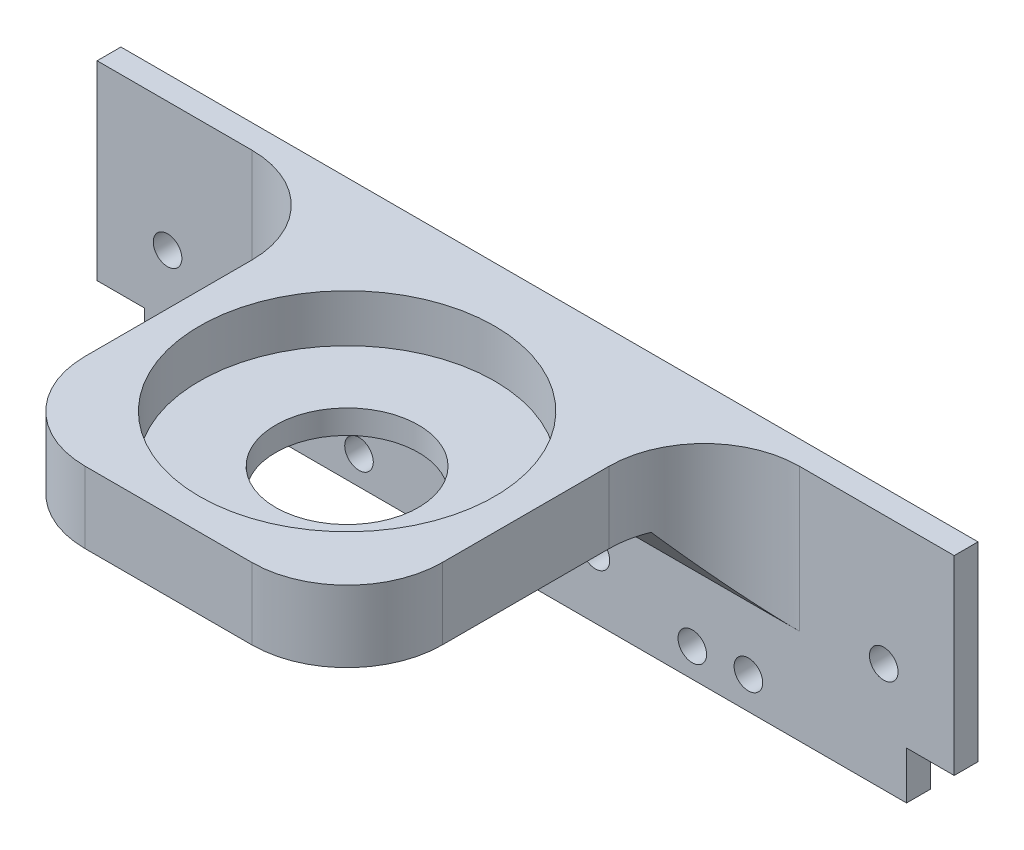
ISO-10303-21;
HEADER;
FILE_DESCRIPTION(('STEP AP214'),'2;1');
FILE_NAME('part.step','',(''),(''),'','','');
FILE_SCHEMA(('AUTOMOTIVE_DESIGN { 1 0 10303 214 1 1 1 1 }'));
ENDSEC;
DATA;
#1=APPLICATION_CONTEXT('core data for automotive mechanical design processes');
#2=APPLICATION_PROTOCOL_DEFINITION('international standard','automotive_design',2000,#1);
#3=PRODUCT_CONTEXT('',#1,'mechanical');
#4=PRODUCT('Part','Part','',(#3));
#5=PRODUCT_RELATED_PRODUCT_CATEGORY('part','',(#4));
#6=PRODUCT_DEFINITION_FORMATION('','',#4);
#7=PRODUCT_DEFINITION_CONTEXT('part definition',#1,'design');
#8=PRODUCT_DEFINITION('design','',#6,#7);
#9=PRODUCT_DEFINITION_SHAPE('','',#8);
#10=(LENGTH_UNIT() NAMED_UNIT(*) SI_UNIT(.MILLI.,.METRE.));
#11=(NAMED_UNIT(*) PLANE_ANGLE_UNIT() SI_UNIT($,.RADIAN.));
#12=(NAMED_UNIT(*) SI_UNIT($,.STERADIAN.) SOLID_ANGLE_UNIT());
#13=UNCERTAINTY_MEASURE_WITH_UNIT(LENGTH_MEASURE(1.E-05),#10,'distance_accuracy_value','');
#14=(GEOMETRIC_REPRESENTATION_CONTEXT(3) GLOBAL_UNCERTAINTY_ASSIGNED_CONTEXT((#13)) GLOBAL_UNIT_ASSIGNED_CONTEXT((#10,
#11,#12)) REPRESENTATION_CONTEXT('',''));
#15=CARTESIAN_POINT('',(0.,0.,0.));
#16=DIRECTION('',(0.,0.,1.));
#17=DIRECTION('',(1.,0.,0.));
#18=AXIS2_PLACEMENT_3D('',#15,#16,#17);
#19=CARTESIAN_POINT('',(5.7960134047091,-7.42640687119285,42.5));
#20=DIRECTION('',(0.,1.,0.));
#21=DIRECTION('',(0.,0.,1.));
#22=AXIS2_PLACEMENT_3D('',#19,#20,#21);
#23=CYLINDRICAL_SURFACE('',#22,15.);
#24=CARTESIAN_POINT('',(5.7960134047091,35.,42.5));
#25=DIRECTION('',(0.,1.,0.));
#26=DIRECTION('',(0.,0.,1.));
#27=AXIS2_PLACEMENT_3D('',#24,#25,#26);
#28=CIRCLE('',#27,15.);
#29=CARTESIAN_POINT('',(5.7960134047091,35.,57.5));
#30=VERTEX_POINT('',#29);
#31=EDGE_CURVE('E210',#30,#30,#28,.F.);
#32=CARTESIAN_POINT('',(5.7960134047091,40.,42.5));
#33=DIRECTION('',(0.,1.,0.));
#34=DIRECTION('',(0.,0.,1.));
#35=AXIS2_PLACEMENT_3D('',#32,#33,#34);
#36=CIRCLE('',#35,15.);
#37=CARTESIAN_POINT('',(5.7960134047091,40.,57.5));
#38=VERTEX_POINT('',#37);
#39=EDGE_CURVE('E207',#38,#38,#36,.F.);
#40=CARTESIAN_POINT('',(5.7960134047091,35.,57.5));
#41=CARTESIAN_POINT('',(5.7960134047091,35.0520833333333,57.5));
#42=CARTESIAN_POINT('',(5.7960134047091,35.1041666666667,57.5));
#43=CARTESIAN_POINT('',(5.7960134047091,35.2083333333333,57.5));
#44=CARTESIAN_POINT('',(5.7960134047091,35.2604166666667,57.5));
#45=CARTESIAN_POINT('',(5.7960134047091,35.3645833333333,57.5));
#46=CARTESIAN_POINT('',(5.7960134047091,35.4166666666667,57.5));
#47=CARTESIAN_POINT('',(5.7960134047091,35.5208333333333,57.5));
#48=CARTESIAN_POINT('',(5.7960134047091,35.5729166666667,57.5));
#49=CARTESIAN_POINT('',(5.7960134047091,35.6770833333333,57.5));
#50=CARTESIAN_POINT('',(5.7960134047091,35.7291666666667,57.5));
#51=CARTESIAN_POINT('',(5.7960134047091,35.8333333333333,57.5));
#52=CARTESIAN_POINT('',(5.7960134047091,35.8854166666667,57.5));
#53=CARTESIAN_POINT('',(5.7960134047091,35.9895833333333,57.5));
#54=CARTESIAN_POINT('',(5.7960134047091,36.0416666666667,57.5));
#55=CARTESIAN_POINT('',(5.7960134047091,36.1458333333333,57.5));
#56=CARTESIAN_POINT('',(5.7960134047091,36.1979166666667,57.5));
#57=CARTESIAN_POINT('',(5.7960134047091,36.3020833333333,57.5));
#58=CARTESIAN_POINT('',(5.7960134047091,36.3541666666667,57.5));
#59=CARTESIAN_POINT('',(5.7960134047091,36.4583333333333,57.5));
#60=CARTESIAN_POINT('',(5.7960134047091,36.5104166666667,57.5));
#61=CARTESIAN_POINT('',(5.7960134047091,36.6145833333333,57.5));
#62=CARTESIAN_POINT('',(5.7960134047091,36.6666666666667,57.5));
#63=CARTESIAN_POINT('',(5.7960134047091,36.7708333333333,57.5));
#64=CARTESIAN_POINT('',(5.7960134047091,36.8229166666667,57.5));
#65=CARTESIAN_POINT('',(5.7960134047091,36.9270833333333,57.5));
#66=CARTESIAN_POINT('',(5.7960134047091,36.9791666666667,57.5));
#67=CARTESIAN_POINT('',(5.7960134047091,37.0833333333333,57.5));
#68=CARTESIAN_POINT('',(5.7960134047091,37.1354166666667,57.5));
#69=CARTESIAN_POINT('',(5.7960134047091,37.2395833333333,57.5));
#70=CARTESIAN_POINT('',(5.7960134047091,37.2916666666667,57.5));
#71=CARTESIAN_POINT('',(5.7960134047091,37.3958333333333,57.5));
#72=CARTESIAN_POINT('',(5.7960134047091,37.4479166666667,57.5));
#73=CARTESIAN_POINT('',(5.7960134047091,37.5520833333333,57.5));
#74=CARTESIAN_POINT('',(5.7960134047091,37.6041666666667,57.5));
#75=CARTESIAN_POINT('',(5.7960134047091,37.7083333333333,57.5));
#76=CARTESIAN_POINT('',(5.7960134047091,37.7604166666667,57.5));
#77=CARTESIAN_POINT('',(5.7960134047091,37.8645833333333,57.5));
#78=CARTESIAN_POINT('',(5.7960134047091,37.9166666666667,57.5));
#79=CARTESIAN_POINT('',(5.7960134047091,38.0208333333333,57.5));
#80=CARTESIAN_POINT('',(5.7960134047091,38.0729166666667,57.5));
#81=CARTESIAN_POINT('',(5.7960134047091,38.1770833333333,57.5));
#82=CARTESIAN_POINT('',(5.7960134047091,38.2291666666667,57.5));
#83=CARTESIAN_POINT('',(5.7960134047091,38.3333333333333,57.5));
#84=CARTESIAN_POINT('',(5.7960134047091,38.3854166666667,57.5));
#85=CARTESIAN_POINT('',(5.7960134047091,38.4895833333333,57.5));
#86=CARTESIAN_POINT('',(5.7960134047091,38.5416666666667,57.5));
#87=CARTESIAN_POINT('',(5.7960134047091,38.6458333333333,57.5));
#88=CARTESIAN_POINT('',(5.7960134047091,38.6979166666667,57.5));
#89=CARTESIAN_POINT('',(5.7960134047091,38.8020833333333,57.5));
#90=CARTESIAN_POINT('',(5.7960134047091,38.8541666666667,57.5));
#91=CARTESIAN_POINT('',(5.7960134047091,38.9583333333333,57.5));
#92=CARTESIAN_POINT('',(5.7960134047091,39.0104166666667,57.5));
#93=CARTESIAN_POINT('',(5.7960134047091,39.1145833333333,57.5));
#94=CARTESIAN_POINT('',(5.7960134047091,39.1666666666667,57.5));
#95=CARTESIAN_POINT('',(5.7960134047091,39.2708333333333,57.5));
#96=CARTESIAN_POINT('',(5.7960134047091,39.3229166666667,57.5));
#97=CARTESIAN_POINT('',(5.7960134047091,39.4270833333333,57.5));
#98=CARTESIAN_POINT('',(5.7960134047091,39.4791666666667,57.5));
#99=CARTESIAN_POINT('',(5.7960134047091,39.5833333333333,57.5));
#100=CARTESIAN_POINT('',(5.7960134047091,39.6354166666667,57.5));
#101=CARTESIAN_POINT('',(5.7960134047091,39.7395833333333,57.5));
#102=CARTESIAN_POINT('',(5.7960134047091,39.7916666666667,57.5));
#103=CARTESIAN_POINT('',(5.7960134047091,39.8958333333333,57.5));
#104=CARTESIAN_POINT('',(5.7960134047091,39.9479166666667,57.5));
#105=CARTESIAN_POINT('',(5.7960134047091,40.,57.5));
#106=B_SPLINE_CURVE_WITH_KNOTS('',3,(#40,#41,#42,#43,#44,#45,#46,#47,#48,#49,#50,#51,#52,#53,
#54,#55,#56,#57,#58,#59,#60,#61,#62,#63,#64,#65,#66,#67,#68,#69,#70,#71,#72,#73,#74,#75,#76,#77,
#78,#79,#80,#81,#82,#83,#84,#85,#86,#87,#88,#89,#90,#91,#92,#93,#94,#95,#96,#97,#98,#99,#100,
#101,#102,#103,#104,#105),.UNSPECIFIED.,.F.,.F.,(4,2,2,2,2,2,2,2,2,2,2,2,2,2,2,2,2,2,2,2,2,2,2,
2,2,2,2,2,2,2,2,2,4),(0.,0.156249999999997,0.3125,0.468750000000004,0.625000000000001,
0.781249999999997,0.937500000000001,1.09375,1.25,1.40625,1.5625,1.71875,1.875,2.03125,2.1875,
2.34375000000001,2.5,2.65625,2.8125,2.96875000000001,3.125,3.28125,3.4375,3.59375000000001,3.75,
3.90625,4.0625,4.21875000000001,4.375,4.53125,4.6875,4.84375000000001,5.),.UNSPECIFIED.);
#107=EDGE_CURVE('BSEAM33',#30,#38,#106,.T.);
#108=ORIENTED_EDGE('',*,*,#31,.T.);
#109=ORIENTED_EDGE('',*,*,#39,.F.);
#110=ORIENTED_EDGE('',*,*,#107,.T.);
#111=ORIENTED_EDGE('',*,*,#107,.F.);
#112=EDGE_LOOP('',(#108,#110,#109,#111));
#113=FACE_BOUND('',#112,.T.);
#114=ADVANCED_FACE('F33',(#113),#23,.F.);
#115=CARTESIAN_POINT('',(0.,0.,5.));
#116=DIRECTION('',(0.,0.,-1.));
#117=DIRECTION('',(-1.,0.,0.));
#118=AXIS2_PLACEMENT_3D('',#115,#116,#117);
#119=PLANE('',#118);
#120=CARTESIAN_POINT('',(20.4535696755675,12.9010851063287,5.));
#121=DIRECTION('',(0.,0.,1.));
#122=DIRECTION('',(-1.,0.,0.));
#123=AXIS2_PLACEMENT_3D('',#120,#121,#122);
#124=CIRCLE('',#123,3.);
#125=CARTESIAN_POINT('',(17.4535696755675,12.9010851063287,5.));
#126=VERTEX_POINT('',#125);
#127=EDGE_CURVE('E288',#126,#126,#124,.T.);
#128=ORIENTED_EDGE('',*,*,#127,.F.);
#129=EDGE_LOOP('',(#128));
#130=FACE_BOUND('',#129,.T.);
#131=CARTESIAN_POINT('',(52.5734958761646,6.77616521020482,5.));
#132=DIRECTION('',(0.,0.,1.));
#133=DIRECTION('',(-1.,0.,0.));
#134=AXIS2_PLACEMENT_3D('',#131,#132,#133);
#135=CIRCLE('',#134,3.00000000000001);
#136=CARTESIAN_POINT('',(49.5734958761646,6.77616521020482,5.));
#137=VERTEX_POINT('',#136);
#138=EDGE_CURVE('E294',#137,#137,#135,.T.);
#139=ORIENTED_EDGE('',*,*,#138,.F.);
#140=EDGE_LOOP('',(#139));
#141=FACE_BOUND('',#140,.T.);
#142=CARTESIAN_POINT('',(80.9980316802519,22.9393971638673,5.));
#143=DIRECTION('',(0.,0.,1.));
#144=DIRECTION('',(-1.,0.,0.));
#145=AXIS2_PLACEMENT_3D('',#142,#143,#144);
#146=CIRCLE('',#145,3.00000000000001);
#147=CARTESIAN_POINT('',(77.9980316802519,22.9393971638673,5.));
#148=VERTEX_POINT('',#147);
#149=EDGE_CURVE('E300',#148,#148,#146,.T.);
#150=ORIENTED_EDGE('',*,*,#149,.F.);
#151=EDGE_LOOP('',(#150));
#152=FACE_BOUND('',#151,.T.);
#153=CARTESIAN_POINT('',(-29.2039865952909,6.00000000000013,5.));
#154=DIRECTION('',(0.,0.,1.));
#155=DIRECTION('',(-1.,0.,0.));
#156=AXIS2_PLACEMENT_3D('',#153,#154,#155);
#157=CIRCLE('',#156,2.99999999999999);
#158=CARTESIAN_POINT('',(-32.2039865952909,6.00000000000013,5.));
#159=VERTEX_POINT('',#158);
#160=EDGE_CURVE('E306',#159,#159,#157,.T.);
#161=ORIENTED_EDGE('',*,*,#160,.F.);
#162=EDGE_LOOP('',(#161));
#163=FACE_BOUND('',#162,.T.);
#164=CARTESIAN_POINT('',(-8.86154286614935,12.9010851063287,5.));
#165=DIRECTION('',(0.,0.,1.));
#166=DIRECTION('',(1.,0.,0.));
#167=AXIS2_PLACEMENT_3D('',#164,#165,#166);
#168=CIRCLE('',#167,3.);
#169=CARTESIAN_POINT('',(-5.86154286614935,12.9010851063287,5.));
#170=VERTEX_POINT('',#169);
#171=EDGE_CURVE('E312',#170,#170,#168,.T.);
#172=ORIENTED_EDGE('',*,*,#171,.F.);
#173=EDGE_LOOP('',(#172));
#174=FACE_BOUND('',#173,.T.);
#175=CARTESIAN_POINT('',(-40.9814690667464,6.77616521020496,5.));
#176=DIRECTION('',(0.,0.,1.));
#177=DIRECTION('',(1.,0.,0.));
#178=AXIS2_PLACEMENT_3D('',#175,#176,#177);
#179=CIRCLE('',#178,3.00000000000001);
#180=CARTESIAN_POINT('',(-37.9814690667464,6.77616521020496,5.));
#181=VERTEX_POINT('',#180);
#182=EDGE_CURVE('E318',#181,#181,#179,.T.);
#183=ORIENTED_EDGE('',*,*,#182,.F.);
#184=EDGE_LOOP('',(#183));
#185=FACE_BOUND('',#184,.T.);
#186=CARTESIAN_POINT('',(-69.4060048708337,22.9393971638675,5.));
#187=DIRECTION('',(0.,0.,1.));
#188=DIRECTION('',(1.,0.,0.));
#189=AXIS2_PLACEMENT_3D('',#186,#187,#188);
#190=CIRCLE('',#189,3.00000000000001);
#191=CARTESIAN_POINT('',(-66.4060048708336,22.9393971638675,5.));
#192=VERTEX_POINT('',#191);
#193=EDGE_CURVE('E324',#192,#192,#190,.T.);
#194=ORIENTED_EDGE('',*,*,#193,.F.);
#195=EDGE_LOOP('',(#194));
#196=FACE_BOUND('',#195,.T.);
#197=CARTESIAN_POINT('',(40.7960134047091,6.,5.));
#198=DIRECTION('',(0.,0.,1.));
#199=DIRECTION('',(1.,0.,0.));
#200=AXIS2_PLACEMENT_3D('',#197,#198,#199);
#201=CIRCLE('',#200,3.);
#202=CARTESIAN_POINT('',(43.7960134047091,6.,5.));
#203=VERTEX_POINT('',#202);
#204=EDGE_CURVE('E196',#203,#203,#201,.T.);
#205=ORIENTED_EDGE('',*,*,#204,.F.);
#206=EDGE_LOOP('',(#205));
#207=FACE_BOUND('',#206,.T.);
#208=DIRECTION('',(0.,-1.,0.));
#209=VECTOR('',#208,1.);
#210=CARTESIAN_POINT('',(85.7960134047091,0.,5.));
#211=LINE('',#210,#209);
#212=CARTESIAN_POINT('',(85.7960134047091,10.,5.));
#213=VERTEX_POINT('',#212);
#214=CARTESIAN_POINT('',(85.7960134047091,0.,5.));
#215=VERTEX_POINT('',#214);
#216=EDGE_CURVE('E152',#213,#215,#211,.T.);
#217=ORIENTED_EDGE('',*,*,#216,.F.);
#218=DIRECTION('',(-1.,0.,0.));
#219=VECTOR('',#218,1.);
#220=CARTESIAN_POINT('',(95.796013404709,9.99999999999991,5.));
#221=LINE('',#220,#219);
#222=CARTESIAN_POINT('',(95.796013404709,9.99999999999991,5.));
#223=VERTEX_POINT('',#222);
#224=EDGE_CURVE('E163',#223,#213,#221,.T.);
#225=ORIENTED_EDGE('',*,*,#224,.F.);
#226=DIRECTION('',(0.,1.,0.));
#227=VECTOR('',#226,1.);
#228=CARTESIAN_POINT('',(95.7960134047091,0.,5.));
#229=LINE('',#228,#227);
#230=CARTESIAN_POINT('',(95.7960134047091,50.,5.));
#231=VERTEX_POINT('',#230);
#232=EDGE_CURVE('E179',#223,#231,#229,.T.);
#233=ORIENTED_EDGE('',*,*,#232,.T.);
#234=DIRECTION('',(-1.,0.,0.));
#235=VECTOR('',#234,1.);
#236=CARTESIAN_POINT('',(-84.2039865952909,50.,5.));
#237=LINE('',#236,#235);
#238=CARTESIAN_POINT('',(63.2960134047091,50.,5.));
#239=VERTEX_POINT('',#238);
#240=EDGE_CURVE('E189',#231,#239,#237,.T.);
#241=ORIENTED_EDGE('',*,*,#240,.T.);
#242=DIRECTION('',(0.,1.,0.));
#243=VECTOR('',#242,1.);
#244=CARTESIAN_POINT('',(63.2960134047091,20.0000000000001,5.));
#245=LINE('',#244,#243);
#246=CARTESIAN_POINT('',(63.2960134047091,20.0000000000001,5.));
#247=VERTEX_POINT('',#246);
#248=EDGE_CURVE('E236',#239,#247,#245,.F.);
#249=ORIENTED_EDGE('',*,*,#248,.T.);
#250=DIRECTION('',(-1.,0.,0.));
#251=VECTOR('',#250,1.);
#252=CARTESIAN_POINT('',(-31.7039865952909,20.0000000000001,5.));
#253=LINE('',#252,#251);
#254=CARTESIAN_POINT('',(-51.7039865952909,20.0000000000001,5.));
#255=VERTEX_POINT('',#254);
#256=EDGE_CURVE('E231',#247,#255,#253,.T.);
#257=ORIENTED_EDGE('',*,*,#256,.T.);
#258=DIRECTION('',(0.,-1.,0.));
#259=VECTOR('',#258,1.);
#260=CARTESIAN_POINT('',(-51.7039865952909,50.,5.));
#261=LINE('',#260,#259);
#262=CARTESIAN_POINT('',(-51.7039865952909,50.,5.));
#263=VERTEX_POINT('',#262);
#264=EDGE_CURVE('E239',#255,#263,#261,.F.);
#265=ORIENTED_EDGE('',*,*,#264,.T.);
#266=CARTESIAN_POINT('',(-84.2039865952909,50.,5.));
#267=VERTEX_POINT('',#266);
#268=EDGE_CURVE('E182',#263,#267,#237,.T.);
#269=ORIENTED_EDGE('',*,*,#268,.T.);
#270=DIRECTION('',(0.,-1.,0.));
#271=VECTOR('',#270,1.);
#272=CARTESIAN_POINT('',(-84.2039865952909,0.,5.));
#273=LINE('',#272,#271);
#274=CARTESIAN_POINT('',(-84.2039865952909,10.,5.));
#275=VERTEX_POINT('',#274);
#276=EDGE_CURVE('E180',#267,#275,#273,.T.);
#277=ORIENTED_EDGE('',*,*,#276,.T.);
#278=DIRECTION('',(-1.,0.,0.));
#279=VECTOR('',#278,1.);
#280=CARTESIAN_POINT('',(-84.2039865952909,10.,5.));
#281=LINE('',#280,#279);
#282=CARTESIAN_POINT('',(-74.2039865952909,10.,5.));
#283=VERTEX_POINT('',#282);
#284=EDGE_CURVE('E467',#283,#275,#281,.T.);
#285=ORIENTED_EDGE('',*,*,#284,.F.);
#286=DIRECTION('',(0.,1.,0.));
#287=VECTOR('',#286,1.);
#288=CARTESIAN_POINT('',(-74.2039865952909,0.,5.));
#289=LINE('',#288,#287);
#290=CARTESIAN_POINT('',(-74.2039865952909,0.,5.));
#291=VERTEX_POINT('',#290);
#292=EDGE_CURVE('E172',#291,#283,#289,.T.);
#293=ORIENTED_EDGE('',*,*,#292,.F.);
#294=DIRECTION('',(1.,0.,0.));
#295=VECTOR('',#294,1.);
#296=CARTESIAN_POINT('',(-84.2039865952909,0.,5.));
#297=LINE('',#296,#295);
#298=EDGE_CURVE('E169',#291,#215,#297,.T.);
#299=ORIENTED_EDGE('',*,*,#298,.T.);
#300=EDGE_LOOP('',(#217,#225,#233,#241,#249,#257,#265,#269,#277,#285,#293,#299));
#301=FACE_BOUND('',#300,.T.);
#302=ADVANCED_FACE('F176',(#130,#141,#152,#163,#174,#185,#196,#207,#301),#119,.F.);
#303=CARTESIAN_POINT('',(0.,0.,0.));
#304=DIRECTION('',(0.,0.,-1.));
#305=DIRECTION('',(-1.,0.,0.));
#306=AXIS2_PLACEMENT_3D('',#303,#304,#305);
#307=PLANE('',#306);
#308=DIRECTION('',(-1.,0.,0.));
#309=VECTOR('',#308,1.);
#310=CARTESIAN_POINT('',(95.796013404709,9.99999999999991,0.));
#311=LINE('',#310,#309);
#312=CARTESIAN_POINT('',(95.7960134047091,9.99999999999991,0.));
#313=VERTEX_POINT('',#312);
#314=CARTESIAN_POINT('',(85.7960134047091,10.,0.));
#315=VERTEX_POINT('',#314);
#316=EDGE_CURVE('E48',#313,#315,#311,.T.);
#317=ORIENTED_EDGE('',*,*,#316,.T.);
#318=DIRECTION('',(0.,-1.,0.));
#319=VECTOR('',#318,1.);
#320=CARTESIAN_POINT('',(85.7960134047091,0.,0.));
#321=LINE('',#320,#319);
#322=CARTESIAN_POINT('',(85.7960134047091,0.,0.));
#323=VERTEX_POINT('',#322);
#324=EDGE_CURVE('E173',#315,#323,#321,.T.);
#325=ORIENTED_EDGE('',*,*,#324,.T.);
#326=DIRECTION('',(1.,0.,0.));
#327=VECTOR('',#326,1.);
#328=CARTESIAN_POINT('',(-84.2039865952909,0.,0.));
#329=LINE('',#328,#327);
#330=CARTESIAN_POINT('',(-74.2039865952909,0.,0.));
#331=VERTEX_POINT('',#330);
#332=EDGE_CURVE('E171',#331,#323,#329,.T.);
#333=ORIENTED_EDGE('',*,*,#332,.F.);
#334=DIRECTION('',(0.,1.,0.));
#335=VECTOR('',#334,1.);
#336=CARTESIAN_POINT('',(-74.2039865952909,0.,0.));
#337=LINE('',#336,#335);
#338=CARTESIAN_POINT('',(-74.2039865952909,10.,0.));
#339=VERTEX_POINT('',#338);
#340=EDGE_CURVE('E56',#331,#339,#337,.T.);
#341=ORIENTED_EDGE('',*,*,#340,.T.);
#342=DIRECTION('',(-1.,0.,0.));
#343=VECTOR('',#342,1.);
#344=CARTESIAN_POINT('',(-84.2039865952909,10.,0.));
#345=LINE('',#344,#343);
#346=CARTESIAN_POINT('',(-84.2039865952909,10.,0.));
#347=VERTEX_POINT('',#346);
#348=EDGE_CURVE('E470',#339,#347,#345,.T.);
#349=ORIENTED_EDGE('',*,*,#348,.T.);
#350=DIRECTION('',(0.,-1.,0.));
#351=VECTOR('',#350,1.);
#352=CARTESIAN_POINT('',(-84.2039865952909,0.,0.));
#353=LINE('',#352,#351);
#354=CARTESIAN_POINT('',(-84.2039865952909,50.,0.));
#355=VERTEX_POINT('',#354);
#356=EDGE_CURVE('E193',#355,#347,#353,.T.);
#357=ORIENTED_EDGE('',*,*,#356,.F.);
#358=DIRECTION('',(-1.,0.,0.));
#359=VECTOR('',#358,1.);
#360=CARTESIAN_POINT('',(-84.2039865952909,50.,0.));
#361=LINE('',#360,#359);
#362=CARTESIAN_POINT('',(95.7960134047091,50.,0.));
#363=VERTEX_POINT('',#362);
#364=EDGE_CURVE('E185',#363,#355,#361,.T.);
#365=ORIENTED_EDGE('',*,*,#364,.F.);
#366=DIRECTION('',(0.,1.,0.));
#367=VECTOR('',#366,1.);
#368=CARTESIAN_POINT('',(95.7960134047091,0.,0.));
#369=LINE('',#368,#367);
#370=EDGE_CURVE('E198',#313,#363,#369,.T.);
#371=ORIENTED_EDGE('',*,*,#370,.F.);
#372=EDGE_LOOP('',(#317,#325,#333,#341,#349,#357,#365,#371));
#373=FACE_BOUND('',#372,.T.);
#374=CARTESIAN_POINT('',(52.5734958761646,6.77616521020482,0.));
#375=DIRECTION('',(0.,0.,1.));
#376=DIRECTION('',(-1.,0.,0.));
#377=AXIS2_PLACEMENT_3D('',#374,#375,#376);
#378=CIRCLE('',#377,3.00000000000001);
#379=CARTESIAN_POINT('',(49.5734958761646,6.77616521020482,0.));
#380=VERTEX_POINT('',#379);
#381=EDGE_CURVE('E291',#380,#380,#378,.T.);
#382=ORIENTED_EDGE('',*,*,#381,.T.);
#383=EDGE_LOOP('',(#382));
#384=FACE_BOUND('',#383,.T.);
#385=CARTESIAN_POINT('',(-29.2039865952909,6.00000000000013,0.));
#386=DIRECTION('',(0.,0.,1.));
#387=DIRECTION('',(-1.,0.,0.));
#388=AXIS2_PLACEMENT_3D('',#385,#386,#387);
#389=CIRCLE('',#388,2.99999999999999);
#390=CARTESIAN_POINT('',(-32.2039865952909,6.00000000000013,0.));
#391=VERTEX_POINT('',#390);
#392=EDGE_CURVE('E303',#391,#391,#389,.T.);
#393=ORIENTED_EDGE('',*,*,#392,.T.);
#394=EDGE_LOOP('',(#393));
#395=FACE_BOUND('',#394,.T.);
#396=CARTESIAN_POINT('',(-40.9814690667464,6.77616521020496,0.));
#397=DIRECTION('',(0.,0.,1.));
#398=DIRECTION('',(1.,0.,0.));
#399=AXIS2_PLACEMENT_3D('',#396,#397,#398);
#400=CIRCLE('',#399,3.00000000000001);
#401=CARTESIAN_POINT('',(-37.9814690667464,6.77616521020496,0.));
#402=VERTEX_POINT('',#401);
#403=EDGE_CURVE('E315',#402,#402,#400,.T.);
#404=ORIENTED_EDGE('',*,*,#403,.T.);
#405=EDGE_LOOP('',(#404));
#406=FACE_BOUND('',#405,.T.);
#407=CARTESIAN_POINT('',(40.7960134047091,6.,0.));
#408=DIRECTION('',(0.,0.,1.));
#409=DIRECTION('',(1.,0.,0.));
#410=AXIS2_PLACEMENT_3D('',#407,#408,#409);
#411=CIRCLE('',#410,3.);
#412=CARTESIAN_POINT('',(43.7960134047091,6.,0.));
#413=VERTEX_POINT('',#412);
#414=EDGE_CURVE('E327',#413,#413,#411,.T.);
#415=ORIENTED_EDGE('',*,*,#414,.T.);
#416=EDGE_LOOP('',(#415));
#417=FACE_BOUND('',#416,.T.);
#418=CARTESIAN_POINT('',(-69.4060048708337,22.9393971638675,0.));
#419=DIRECTION('',(0.,0.,1.));
#420=DIRECTION('',(1.,0.,0.));
#421=AXIS2_PLACEMENT_3D('',#418,#419,#420);
#422=CIRCLE('',#421,3.00000000000001);
#423=CARTESIAN_POINT('',(-66.4060048708336,22.9393971638675,0.));
#424=VERTEX_POINT('',#423);
#425=EDGE_CURVE('E321',#424,#424,#422,.T.);
#426=ORIENTED_EDGE('',*,*,#425,.T.);
#427=EDGE_LOOP('',(#426));
#428=FACE_BOUND('',#427,.T.);
#429=CARTESIAN_POINT('',(-8.86154286614935,12.9010851063287,0.));
#430=DIRECTION('',(0.,0.,1.));
#431=DIRECTION('',(1.,0.,0.));
#432=AXIS2_PLACEMENT_3D('',#429,#430,#431);
#433=CIRCLE('',#432,3.);
#434=CARTESIAN_POINT('',(-5.86154286614935,12.9010851063287,0.));
#435=VERTEX_POINT('',#434);
#436=EDGE_CURVE('E309',#435,#435,#433,.T.);
#437=ORIENTED_EDGE('',*,*,#436,.T.);
#438=EDGE_LOOP('',(#437));
#439=FACE_BOUND('',#438,.T.);
#440=CARTESIAN_POINT('',(80.9980316802519,22.9393971638673,0.));
#441=DIRECTION('',(0.,0.,1.));
#442=DIRECTION('',(-1.,0.,0.));
#443=AXIS2_PLACEMENT_3D('',#440,#441,#442);
#444=CIRCLE('',#443,3.00000000000001);
#445=CARTESIAN_POINT('',(77.9980316802519,22.9393971638673,0.));
#446=VERTEX_POINT('',#445);
#447=EDGE_CURVE('E297',#446,#446,#444,.T.);
#448=ORIENTED_EDGE('',*,*,#447,.T.);
#449=EDGE_LOOP('',(#448));
#450=FACE_BOUND('',#449,.T.);
#451=CARTESIAN_POINT('',(20.4535696755675,12.9010851063287,0.));
#452=DIRECTION('',(0.,0.,1.));
#453=DIRECTION('',(-1.,0.,0.));
#454=AXIS2_PLACEMENT_3D('',#451,#452,#453);
#455=CIRCLE('',#454,3.);
#456=CARTESIAN_POINT('',(17.4535696755675,12.9010851063287,0.));
#457=VERTEX_POINT('',#456);
#458=EDGE_CURVE('E287',#457,#457,#455,.T.);
#459=ORIENTED_EDGE('',*,*,#458,.T.);
#460=EDGE_LOOP('',(#459));
#461=FACE_BOUND('',#460,.T.);
#462=ADVANCED_FACE('F334',(#373,#384,#395,#406,#417,#428,#439,#450,#461),#307,.T.);
#463=CARTESIAN_POINT('',(-84.2039865952909,0.,5.));
#464=DIRECTION('',(1.,0.,0.));
#465=DIRECTION('',(0.,0.,-1.));
#466=AXIS2_PLACEMENT_3D('',#463,#464,#465);
#467=PLANE('',#466);
#468=ORIENTED_EDGE('',*,*,#356,.T.);
#469=DIRECTION('',(0.,0.,1.));
#470=VECTOR('',#469,1.);
#471=CARTESIAN_POINT('',(-84.2039865952909,10.,-14.142135623731));
#472=LINE('',#471,#470);
#473=EDGE_CURVE('E462',#347,#275,#472,.T.);
#474=ORIENTED_EDGE('',*,*,#473,.T.);
#475=ORIENTED_EDGE('',*,*,#276,.F.);
#476=DIRECTION('',(0.,0.,-1.));
#477=VECTOR('',#476,1.);
#478=CARTESIAN_POINT('',(-84.2039865952909,50.,5.));
#479=LINE('',#478,#477);
#480=EDGE_CURVE('E192',#267,#355,#479,.T.);
#481=ORIENTED_EDGE('',*,*,#480,.T.);
#482=EDGE_LOOP('',(#468,#474,#475,#481));
#483=FACE_BOUND('',#482,.T.);
#484=ADVANCED_FACE('F410',(#483),#467,.F.);
#485=CARTESIAN_POINT('',(-84.2039865952909,0.,5.));
#486=DIRECTION('',(0.,1.,0.));
#487=DIRECTION('',(0.,0.,1.));
#488=AXIS2_PLACEMENT_3D('',#485,#486,#487);
#489=PLANE('',#488);
#490=ORIENTED_EDGE('',*,*,#332,.T.);
#491=DIRECTION('',(0.,0.,1.));
#492=VECTOR('',#491,1.);
#493=CARTESIAN_POINT('',(85.7960134047091,0.,-14.142135623731));
#494=LINE('',#493,#492);
#495=EDGE_CURVE('E155',#323,#215,#494,.T.);
#496=ORIENTED_EDGE('',*,*,#495,.T.);
#497=ORIENTED_EDGE('',*,*,#298,.F.);
#498=DIRECTION('',(0.,0.,1.));
#499=VECTOR('',#498,1.);
#500=CARTESIAN_POINT('',(-74.2039865952909,0.,-14.142135623731));
#501=LINE('',#500,#499);
#502=EDGE_CURVE('E465',#331,#291,#501,.T.);
#503=ORIENTED_EDGE('',*,*,#502,.F.);
#504=EDGE_LOOP('',(#490,#496,#497,#503));
#505=FACE_BOUND('',#504,.T.);
#506=ADVANCED_FACE('F168',(#505),#489,.F.);
#507=CARTESIAN_POINT('',(95.7960134047091,0.,5.));
#508=DIRECTION('',(-1.,0.,0.));
#509=DIRECTION('',(0.,0.,1.));
#510=AXIS2_PLACEMENT_3D('',#507,#508,#509);
#511=PLANE('',#510);
#512=ORIENTED_EDGE('',*,*,#232,.F.);
#513=DIRECTION('',(0.,0.,1.));
#514=VECTOR('',#513,1.);
#515=CARTESIAN_POINT('',(95.796013404709,9.99999999999991,-14.142135623731));
#516=LINE('',#515,#514);
#517=EDGE_CURVE('E162',#313,#223,#516,.T.);
#518=ORIENTED_EDGE('',*,*,#517,.F.);
#519=ORIENTED_EDGE('',*,*,#370,.T.);
#520=DIRECTION('',(0.,0.,-1.));
#521=VECTOR('',#520,1.);
#522=CARTESIAN_POINT('',(95.7960134047091,50.,5.));
#523=LINE('',#522,#521);
#524=EDGE_CURVE('E203',#231,#363,#523,.T.);
#525=ORIENTED_EDGE('',*,*,#524,.F.);
#526=EDGE_LOOP('',(#512,#518,#519,#525));
#527=FACE_BOUND('',#526,.T.);
#528=ADVANCED_FACE('F350',(#527),#511,.F.);
#529=CARTESIAN_POINT('',(-84.2039865952909,50.,5.));
#530=DIRECTION('',(0.,-1.,0.));
#531=DIRECTION('',(0.,0.,-1.));
#532=AXIS2_PLACEMENT_3D('',#529,#530,#531);
#533=PLANE('',#532);
#534=CARTESIAN_POINT('',(5.7960134047091,50.,42.5));
#535=DIRECTION('',(0.,1.,0.));
#536=DIRECTION('',(0.,0.,1.));
#537=AXIS2_PLACEMENT_3D('',#534,#535,#536);
#538=CIRCLE('',#537,31.);
#539=CARTESIAN_POINT('',(5.7960134047091,50.,73.5));
#540=VERTEX_POINT('',#539);
#541=EDGE_CURVE('E459',#540,#540,#538,.T.);
#542=ORIENTED_EDGE('',*,*,#541,.F.);
#543=EDGE_LOOP('',(#542));
#544=FACE_BOUND('',#543,.T.);
#545=DIRECTION('',(0.,0.,-1.));
#546=VECTOR('',#545,1.);
#547=CARTESIAN_POINT('',(-31.7039865952909,50.,80.));
#548=LINE('',#547,#546);
#549=CARTESIAN_POINT('',(-31.7039865952909,50.,60.));
#550=VERTEX_POINT('',#549);
#551=CARTESIAN_POINT('',(-31.7039865952909,50.,25.));
#552=VERTEX_POINT('',#551);
#553=EDGE_CURVE('E276',#550,#552,#548,.T.);
#554=ORIENTED_EDGE('',*,*,#553,.F.);
#555=CARTESIAN_POINT('',(-11.7039865952909,50.,60.));
#556=DIRECTION('',(0.,-1.,0.));
#557=DIRECTION('',(0.,0.,-1.));
#558=AXIS2_PLACEMENT_3D('',#555,#556,#557);
#559=CIRCLE('',#558,20.);
#560=CARTESIAN_POINT('',(-11.7039865952909,50.,80.));
#561=VERTEX_POINT('',#560);
#562=EDGE_CURVE('E225',#550,#561,#559,.F.);
#563=ORIENTED_EDGE('',*,*,#562,.T.);
#564=DIRECTION('',(-1.,0.,0.));
#565=VECTOR('',#564,1.);
#566=CARTESIAN_POINT('',(-31.7039865952909,50.,80.));
#567=LINE('',#566,#565);
#568=CARTESIAN_POINT('',(23.2960134047091,50.,80.));
#569=VERTEX_POINT('',#568);
#570=EDGE_CURVE('E279',#569,#561,#567,.T.);
#571=ORIENTED_EDGE('',*,*,#570,.F.);
#572=CARTESIAN_POINT('',(23.2960134047091,50.,60.));
#573=DIRECTION('',(0.,-1.,0.));
#574=DIRECTION('',(0.,0.,-1.));
#575=AXIS2_PLACEMENT_3D('',#572,#573,#574);
#576=CIRCLE('',#575,20.);
#577=CARTESIAN_POINT('',(43.2960134047091,50.,60.));
#578=VERTEX_POINT('',#577);
#579=EDGE_CURVE('E223',#569,#578,#576,.F.);
#580=ORIENTED_EDGE('',*,*,#579,.T.);
#581=DIRECTION('',(0.,0.,-1.));
#582=VECTOR('',#581,1.);
#583=CARTESIAN_POINT('',(43.2960134047091,50.,80.));
#584=LINE('',#583,#582);
#585=CARTESIAN_POINT('',(43.2960134047091,50.,25.));
#586=VERTEX_POINT('',#585);
#587=EDGE_CURVE('E285',#578,#586,#584,.T.);
#588=ORIENTED_EDGE('',*,*,#587,.T.);
#589=CARTESIAN_POINT('',(63.2960134047091,50.,25.));
#590=DIRECTION('',(0.,-1.,0.));
#591=DIRECTION('',(0.,0.,-1.));
#592=AXIS2_PLACEMENT_3D('',#589,#590,#591);
#593=CIRCLE('',#592,20.);
#594=EDGE_CURVE('E252',#586,#239,#593,.T.);
#595=ORIENTED_EDGE('',*,*,#594,.T.);
#596=ORIENTED_EDGE('',*,*,#240,.F.);
#597=ORIENTED_EDGE('',*,*,#524,.T.);
#598=ORIENTED_EDGE('',*,*,#364,.T.);
#599=ORIENTED_EDGE('',*,*,#480,.F.);
#600=ORIENTED_EDGE('',*,*,#268,.F.);
#601=CARTESIAN_POINT('',(-51.7039865952909,50.,25.));
#602=DIRECTION('',(0.,-1.,0.));
#603=DIRECTION('',(0.,0.,-1.));
#604=AXIS2_PLACEMENT_3D('',#601,#602,#603);
#605=CIRCLE('',#604,20.);
#606=EDGE_CURVE('E250',#263,#552,#605,.T.);
#607=ORIENTED_EDGE('',*,*,#606,.T.);
#608=EDGE_LOOP('',(#554,#563,#571,#580,#588,#595,#596,#597,#598,#599,#600,#607));
#609=FACE_BOUND('',#608,.T.);
#610=ADVANCED_FACE('F340',(#544,#609),#533,.F.);
#611=CARTESIAN_POINT('',(40.7960134047091,6.,5.));
#612=DIRECTION('',(0.,0.,-1.));
#613=DIRECTION('',(-1.,0.,0.));
#614=AXIS2_PLACEMENT_3D('',#611,#612,#613);
#615=CYLINDRICAL_SURFACE('',#614,3.);
#616=ORIENTED_EDGE('',*,*,#204,.T.);
#617=EDGE_LOOP('',(#616));
#618=FACE_BOUND('',#617,.T.);
#619=ORIENTED_EDGE('',*,*,#414,.F.);
#620=EDGE_LOOP('',(#619));
#621=FACE_BOUND('',#620,.T.);
#622=ADVANCED_FACE('F337',(#618,#621),#615,.F.);
#623=CARTESIAN_POINT('',(-69.4060048708337,22.9393971638675,5.));
#624=DIRECTION('',(0.,0.,-1.));
#625=DIRECTION('',(-1.,0.,0.));
#626=AXIS2_PLACEMENT_3D('',#623,#624,#625);
#627=CYLINDRICAL_SURFACE('',#626,3.00000000000001);
#628=ORIENTED_EDGE('',*,*,#193,.T.);
#629=EDGE_LOOP('',(#628));
#630=FACE_BOUND('',#629,.T.);
#631=ORIENTED_EDGE('',*,*,#425,.F.);
#632=EDGE_LOOP('',(#631));
#633=FACE_BOUND('',#632,.T.);
#634=ADVANCED_FACE('F339',(#630,#633),#627,.F.);
#635=CARTESIAN_POINT('',(-40.9814690667464,6.77616521020496,5.));
#636=DIRECTION('',(0.,0.,-1.));
#637=DIRECTION('',(-1.,0.,0.));
#638=AXIS2_PLACEMENT_3D('',#635,#636,#637);
#639=CYLINDRICAL_SURFACE('',#638,3.00000000000001);
#640=ORIENTED_EDGE('',*,*,#182,.T.);
#641=EDGE_LOOP('',(#640));
#642=FACE_BOUND('',#641,.T.);
#643=ORIENTED_EDGE('',*,*,#403,.F.);
#644=EDGE_LOOP('',(#643));
#645=FACE_BOUND('',#644,.T.);
#646=ADVANCED_FACE('F347',(#642,#645),#639,.F.);
#647=CARTESIAN_POINT('',(-8.86154286614935,12.9010851063287,5.));
#648=DIRECTION('',(0.,0.,-1.));
#649=DIRECTION('',(-1.,0.,0.));
#650=AXIS2_PLACEMENT_3D('',#647,#648,#649);
#651=CYLINDRICAL_SURFACE('',#650,3.);
#652=ORIENTED_EDGE('',*,*,#171,.T.);
#653=EDGE_LOOP('',(#652));
#654=FACE_BOUND('',#653,.T.);
#655=ORIENTED_EDGE('',*,*,#436,.F.);
#656=EDGE_LOOP('',(#655));
#657=FACE_BOUND('',#656,.T.);
#658=ADVANCED_FACE('F396',(#654,#657),#651,.F.);
#659=CARTESIAN_POINT('',(-29.2039865952909,6.00000000000013,5.));
#660=DIRECTION('',(0.,0.,-1.));
#661=DIRECTION('',(-1.,0.,0.));
#662=AXIS2_PLACEMENT_3D('',#659,#660,#661);
#663=CYLINDRICAL_SURFACE('',#662,2.99999999999999);
#664=ORIENTED_EDGE('',*,*,#160,.T.);
#665=EDGE_LOOP('',(#664));
#666=FACE_BOUND('',#665,.T.);
#667=ORIENTED_EDGE('',*,*,#392,.F.);
#668=EDGE_LOOP('',(#667));
#669=FACE_BOUND('',#668,.T.);
#670=ADVANCED_FACE('F392',(#666,#669),#663,.F.);
#671=CARTESIAN_POINT('',(80.9980316802519,22.9393971638673,5.));
#672=DIRECTION('',(0.,0.,-1.));
#673=DIRECTION('',(-1.,0.,0.));
#674=AXIS2_PLACEMENT_3D('',#671,#672,#673);
#675=CYLINDRICAL_SURFACE('',#674,3.00000000000001);
#676=ORIENTED_EDGE('',*,*,#149,.T.);
#677=EDGE_LOOP('',(#676));
#678=FACE_BOUND('',#677,.T.);
#679=ORIENTED_EDGE('',*,*,#447,.F.);
#680=EDGE_LOOP('',(#679));
#681=FACE_BOUND('',#680,.T.);
#682=ADVANCED_FACE('F388',(#678,#681),#675,.F.);
#683=CARTESIAN_POINT('',(52.5734958761646,6.77616521020482,5.));
#684=DIRECTION('',(0.,0.,-1.));
#685=DIRECTION('',(-1.,0.,0.));
#686=AXIS2_PLACEMENT_3D('',#683,#684,#685);
#687=CYLINDRICAL_SURFACE('',#686,3.00000000000001);
#688=ORIENTED_EDGE('',*,*,#138,.T.);
#689=EDGE_LOOP('',(#688));
#690=FACE_BOUND('',#689,.T.);
#691=ORIENTED_EDGE('',*,*,#381,.F.);
#692=EDGE_LOOP('',(#691));
#693=FACE_BOUND('',#692,.T.);
#694=ADVANCED_FACE('F384',(#690,#693),#687,.F.);
#695=CARTESIAN_POINT('',(20.4535696755675,12.9010851063287,5.));
#696=DIRECTION('',(0.,0.,-1.));
#697=DIRECTION('',(-1.,0.,0.));
#698=AXIS2_PLACEMENT_3D('',#695,#696,#697);
#699=CYLINDRICAL_SURFACE('',#698,3.);
#700=ORIENTED_EDGE('',*,*,#127,.T.);
#701=EDGE_LOOP('',(#700));
#702=FACE_BOUND('',#701,.T.);
#703=ORIENTED_EDGE('',*,*,#458,.F.);
#704=EDGE_LOOP('',(#703));
#705=FACE_BOUND('',#704,.T.);
#706=ADVANCED_FACE('F381',(#702,#705),#699,.F.);
#707=CARTESIAN_POINT('',(43.2960134047091,35.,80.));
#708=DIRECTION('',(-1.,0.,0.));
#709=DIRECTION('',(0.,0.,1.));
#710=AXIS2_PLACEMENT_3D('',#707,#708,#709);
#711=PLANE('',#710);
#712=DIRECTION('',(0.,0.,-1.));
#713=VECTOR('',#712,1.);
#714=CARTESIAN_POINT('',(43.2960134047091,35.,80.));
#715=LINE('',#714,#713);
#716=CARTESIAN_POINT('',(43.2960134047091,35.,60.));
#717=VERTEX_POINT('',#716);
#718=CARTESIAN_POINT('',(43.2960134047091,35.,25.));
#719=VERTEX_POINT('',#718);
#720=EDGE_CURVE('E266',#717,#719,#715,.T.);
#721=ORIENTED_EDGE('',*,*,#720,.T.);
#722=DIRECTION('',(0.,1.,0.));
#723=VECTOR('',#722,1.);
#724=CARTESIAN_POINT('',(43.2960134047091,50.,25.));
#725=LINE('',#724,#723);
#726=EDGE_CURVE('E241',#719,#586,#725,.T.);
#727=ORIENTED_EDGE('',*,*,#726,.T.);
#728=ORIENTED_EDGE('',*,*,#587,.F.);
#729=DIRECTION('',(0.,1.,0.));
#730=VECTOR('',#729,1.);
#731=CARTESIAN_POINT('',(43.2960134047091,35.,60.));
#732=LINE('',#731,#730);
#733=EDGE_CURVE('E227',#578,#717,#732,.F.);
#734=ORIENTED_EDGE('',*,*,#733,.T.);
#735=EDGE_LOOP('',(#721,#727,#728,#734));
#736=FACE_BOUND('',#735,.T.);
#737=ADVANCED_FACE('F269',(#736),#711,.F.);
#738=CARTESIAN_POINT('',(-31.7039865952909,35.,80.));
#739=DIRECTION('',(1.,0.,0.));
#740=DIRECTION('',(0.,0.,-1.));
#741=AXIS2_PLACEMENT_3D('',#738,#739,#740);
#742=PLANE('',#741);
#743=ORIENTED_EDGE('',*,*,#553,.T.);
#744=DIRECTION('',(0.,-1.,0.));
#745=VECTOR('',#744,1.);
#746=CARTESIAN_POINT('',(-31.7039865952909,20.0000000000001,25.));
#747=LINE('',#746,#745);
#748=CARTESIAN_POINT('',(-31.7039865952909,35.,25.));
#749=VERTEX_POINT('',#748);
#750=EDGE_CURVE('E233',#552,#749,#747,.T.);
#751=ORIENTED_EDGE('',*,*,#750,.T.);
#752=DIRECTION('',(0.,0.,-1.));
#753=VECTOR('',#752,1.);
#754=CARTESIAN_POINT('',(-31.7039865952909,35.,80.));
#755=LINE('',#754,#753);
#756=CARTESIAN_POINT('',(-31.7039865952909,35.,60.));
#757=VERTEX_POINT('',#756);
#758=EDGE_CURVE('E273',#757,#749,#755,.T.);
#759=ORIENTED_EDGE('',*,*,#758,.F.);
#760=DIRECTION('',(0.,-1.,0.));
#761=VECTOR('',#760,1.);
#762=CARTESIAN_POINT('',(-31.7039865952909,35.,60.));
#763=LINE('',#762,#761);
#764=EDGE_CURVE('E221',#757,#550,#763,.F.);
#765=ORIENTED_EDGE('',*,*,#764,.T.);
#766=EDGE_LOOP('',(#743,#751,#759,#765));
#767=FACE_BOUND('',#766,.T.);
#768=ADVANCED_FACE('F374',(#767),#742,.F.);
#769=CARTESIAN_POINT('',(-31.7039865952909,35.,80.));
#770=DIRECTION('',(0.,1.,0.));
#771=DIRECTION('',(0.,0.,1.));
#772=AXIS2_PLACEMENT_3D('',#769,#770,#771);
#773=PLANE('',#772);
#774=ORIENTED_EDGE('',*,*,#31,.F.);
#775=EDGE_LOOP('',(#774));
#776=FACE_BOUND('',#775,.T.);
#777=ORIENTED_EDGE('',*,*,#758,.T.);
#778=CARTESIAN_POINT('',(-51.7039865952909,35.,25.));
#779=DIRECTION('',(0.,1.,0.));
#780=DIRECTION('',(0.,0.,1.));
#781=AXIS2_PLACEMENT_3D('',#778,#779,#780);
#782=CIRCLE('',#781,20.);
#783=CARTESIAN_POINT('',(-33.1287359718954,35.,17.5864944676593));
#784=VERTEX_POINT('',#783);
#785=EDGE_CURVE('E244',#749,#784,#782,.T.);
#786=ORIENTED_EDGE('',*,*,#785,.T.);
#787=DIRECTION('',(1.,0.,0.));
#788=VECTOR('',#787,1.);
#789=CARTESIAN_POINT('',(43.2960134047091,35.,17.5864944676593));
#790=LINE('',#789,#788);
#791=CARTESIAN_POINT('',(44.7207627813137,35.,17.5864944676593));
#792=VERTEX_POINT('',#791);
#793=EDGE_CURVE('E229',#784,#792,#790,.T.);
#794=ORIENTED_EDGE('',*,*,#793,.T.);
#795=CARTESIAN_POINT('',(63.2960134047091,35.,25.));
#796=DIRECTION('',(0.,1.,0.));
#797=DIRECTION('',(0.,0.,1.));
#798=AXIS2_PLACEMENT_3D('',#795,#796,#797);
#799=CIRCLE('',#798,20.);
#800=EDGE_CURVE('E11',#792,#719,#799,.T.);
#801=ORIENTED_EDGE('',*,*,#800,.T.);
#802=ORIENTED_EDGE('',*,*,#720,.F.);
#803=CARTESIAN_POINT('',(23.2960134047091,35.,60.));
#804=DIRECTION('',(0.,1.,0.));
#805=DIRECTION('',(0.,0.,1.));
#806=AXIS2_PLACEMENT_3D('',#803,#804,#805);
#807=CIRCLE('',#806,20.);
#808=CARTESIAN_POINT('',(23.2960134047091,35.,80.));
#809=VERTEX_POINT('',#808);
#810=EDGE_CURVE('E217',#717,#809,#807,.F.);
#811=ORIENTED_EDGE('',*,*,#810,.T.);
#812=DIRECTION('',(1.,0.,0.));
#813=VECTOR('',#812,1.);
#814=CARTESIAN_POINT('',(-31.7039865952909,35.,80.));
#815=LINE('',#814,#813);
#816=CARTESIAN_POINT('',(-11.7039865952909,35.,80.));
#817=VERTEX_POINT('',#816);
#818=EDGE_CURVE('E274',#817,#809,#815,.T.);
#819=ORIENTED_EDGE('',*,*,#818,.F.);
#820=CARTESIAN_POINT('',(-11.7039865952909,35.,60.));
#821=DIRECTION('',(0.,1.,0.));
#822=DIRECTION('',(0.,0.,1.));
#823=AXIS2_PLACEMENT_3D('',#820,#821,#822);
#824=CIRCLE('',#823,20.);
#825=EDGE_CURVE('E219',#817,#757,#824,.F.);
#826=ORIENTED_EDGE('',*,*,#825,.T.);
#827=EDGE_LOOP('',(#777,#786,#794,#801,#802,#811,#819,#826));
#828=FACE_BOUND('',#827,.T.);
#829=ADVANCED_FACE('F265',(#776,#828),#773,.F.);
#830=CARTESIAN_POINT('',(0.,0.,80.));
#831=DIRECTION('',(0.,0.,-1.));
#832=DIRECTION('',(-1.,0.,0.));
#833=AXIS2_PLACEMENT_3D('',#830,#831,#832);
#834=PLANE('',#833);
#835=ORIENTED_EDGE('',*,*,#570,.T.);
#836=DIRECTION('',(0.,-1.,0.));
#837=VECTOR('',#836,1.);
#838=CARTESIAN_POINT('',(-11.7039865952909,0.,80.));
#839=LINE('',#838,#837);
#840=EDGE_CURVE('E214',#561,#817,#839,.T.);
#841=ORIENTED_EDGE('',*,*,#840,.T.);
#842=ORIENTED_EDGE('',*,*,#818,.T.);
#843=DIRECTION('',(0.,1.,0.));
#844=VECTOR('',#843,1.);
#845=CARTESIAN_POINT('',(23.2960134047091,0.,80.));
#846=LINE('',#845,#844);
#847=EDGE_CURVE('E206',#809,#569,#846,.T.);
#848=ORIENTED_EDGE('',*,*,#847,.T.);
#849=EDGE_LOOP('',(#835,#841,#842,#848));
#850=FACE_BOUND('',#849,.T.);
#851=ADVANCED_FACE('F367',(#850),#834,.F.);
#852=CARTESIAN_POINT('',(5.7960134047091,40.,42.5));
#853=DIRECTION('',(0.,1.,0.));
#854=DIRECTION('',(0.,0.,1.));
#855=AXIS2_PLACEMENT_3D('',#852,#853,#854);
#856=PLANE('',#855);
#857=CARTESIAN_POINT('',(5.7960134047091,40.,42.5));
#858=DIRECTION('',(0.,1.,0.));
#859=DIRECTION('',(0.,0.,1.));
#860=AXIS2_PLACEMENT_3D('',#857,#858,#859);
#861=CIRCLE('',#860,31.);
#862=CARTESIAN_POINT('',(5.7960134047091,40.,73.5));
#863=VERTEX_POINT('',#862);
#864=EDGE_CURVE('E211',#863,#863,#861,.T.);
#865=ORIENTED_EDGE('',*,*,#864,.T.);
#866=EDGE_LOOP('',(#865));
#867=FACE_BOUND('',#866,.T.);
#868=ORIENTED_EDGE('',*,*,#39,.T.);
#869=EDGE_LOOP('',(#868));
#870=FACE_BOUND('',#869,.T.);
#871=ADVANCED_FACE('F370',(#867,#870),#856,.T.);
#872=CARTESIAN_POINT('',(5.7960134047091,40.,42.5));
#873=DIRECTION('',(0.,1.,0.));
#874=DIRECTION('',(0.,0.,1.));
#875=AXIS2_PLACEMENT_3D('',#872,#873,#874);
#876=CYLINDRICAL_SURFACE('',#875,31.);
#877=ORIENTED_EDGE('',*,*,#864,.F.);
#878=EDGE_LOOP('',(#877));
#879=FACE_BOUND('',#878,.T.);
#880=ORIENTED_EDGE('',*,*,#541,.T.);
#881=EDGE_LOOP('',(#880));
#882=FACE_BOUND('',#881,.T.);
#883=ADVANCED_FACE('F365',(#879,#882),#876,.F.);
#884=CARTESIAN_POINT('',(-11.7039865952909,0.,60.));
#885=DIRECTION('',(0.,-1.,0.));
#886=DIRECTION('',(0.,0.,-1.));
#887=AXIS2_PLACEMENT_3D('',#884,#885,#886);
#888=CYLINDRICAL_SURFACE('',#887,20.);
#889=ORIENTED_EDGE('',*,*,#562,.F.);
#890=ORIENTED_EDGE('',*,*,#764,.F.);
#891=ORIENTED_EDGE('',*,*,#825,.F.);
#892=ORIENTED_EDGE('',*,*,#840,.F.);
#893=EDGE_LOOP('',(#889,#890,#891,#892));
#894=FACE_BOUND('',#893,.T.);
#895=ADVANCED_FACE('F425',(#894),#888,.T.);
#896=CARTESIAN_POINT('',(23.2960134047091,0.,60.));
#897=DIRECTION('',(0.,1.,0.));
#898=DIRECTION('',(0.,0.,1.));
#899=AXIS2_PLACEMENT_3D('',#896,#897,#898);
#900=CYLINDRICAL_SURFACE('',#899,20.);
#901=ORIENTED_EDGE('',*,*,#810,.F.);
#902=ORIENTED_EDGE('',*,*,#733,.F.);
#903=ORIENTED_EDGE('',*,*,#579,.F.);
#904=ORIENTED_EDGE('',*,*,#847,.F.);
#905=EDGE_LOOP('',(#901,#902,#903,#904));
#906=FACE_BOUND('',#905,.T.);
#907=ADVANCED_FACE('F428',(#906),#900,.T.);
#908=CARTESIAN_POINT('',(-31.7039865952909,35.,17.5864944676593));
#909=DIRECTION('',(0.,-0.642787609686544,0.766044443118975));
#910=DIRECTION('',(-1.,0.,0.));
#911=AXIS2_PLACEMENT_3D('',#908,#909,#910);
#912=PLANE('',#911);
#913=ORIENTED_EDGE('',*,*,#793,.F.);
#914=CARTESIAN_POINT('',(-51.7039865952909,43.835071851884,25.));
#915=DIRECTION('',(0.,-0.642787609686544,0.766044443118975));
#916=DIRECTION('',(0.,0.766044443118974,0.642787609686543));
#917=AXIS2_PLACEMENT_3D('',#914,#915,#916);
#918=ELLIPSE('',#917,31.114476537208,20.);
#919=EDGE_CURVE('E247',#784,#255,#918,.F.);
#920=ORIENTED_EDGE('',*,*,#919,.T.);
#921=ORIENTED_EDGE('',*,*,#256,.F.);
#922=CARTESIAN_POINT('',(63.2960134047091,43.835071851884,25.));
#923=DIRECTION('',(0.,-0.642787609686544,0.766044443118975));
#924=DIRECTION('',(0.,-0.766044443118974,-0.642787609686543));
#925=AXIS2_PLACEMENT_3D('',#922,#923,#924);
#926=ELLIPSE('',#925,31.114476537208,20.);
#927=EDGE_CURVE('E41',#247,#792,#926,.F.);
#928=ORIENTED_EDGE('',*,*,#927,.T.);
#929=EDGE_LOOP('',(#913,#920,#921,#928));
#930=FACE_BOUND('',#929,.T.);
#931=ADVANCED_FACE('F257',(#930),#912,.T.);
#932=CARTESIAN_POINT('',(-51.7039865952909,35.,25.));
#933=DIRECTION('',(0.,1.,0.));
#934=DIRECTION('',(0.,0.,1.));
#935=AXIS2_PLACEMENT_3D('',#932,#933,#934);
#936=CYLINDRICAL_SURFACE('',#935,20.);
#937=ORIENTED_EDGE('',*,*,#606,.F.);
#938=ORIENTED_EDGE('',*,*,#264,.F.);
#939=ORIENTED_EDGE('',*,*,#919,.F.);
#940=ORIENTED_EDGE('',*,*,#785,.F.);
#941=ORIENTED_EDGE('',*,*,#750,.F.);
#942=EDGE_LOOP('',(#937,#938,#939,#940,#941));
#943=FACE_BOUND('',#942,.T.);
#944=ADVANCED_FACE('F434',(#943),#936,.F.);
#945=CARTESIAN_POINT('',(63.2960134047091,35.,25.));
#946=DIRECTION('',(0.,-1.,0.));
#947=DIRECTION('',(0.,0.,-1.));
#948=AXIS2_PLACEMENT_3D('',#945,#946,#947);
#949=CYLINDRICAL_SURFACE('',#948,20.);
#950=ORIENTED_EDGE('',*,*,#927,.F.);
#951=ORIENTED_EDGE('',*,*,#248,.F.);
#952=ORIENTED_EDGE('',*,*,#594,.F.);
#953=ORIENTED_EDGE('',*,*,#726,.F.);
#954=ORIENTED_EDGE('',*,*,#800,.F.);
#955=EDGE_LOOP('',(#950,#951,#952,#953,#954));
#956=FACE_BOUND('',#955,.T.);
#957=ADVANCED_FACE('F35',(#956),#949,.F.);
#958=CARTESIAN_POINT('',(-74.2039865952909,0.,-14.142135623731));
#959=DIRECTION('',(1.,0.,0.));
#960=DIRECTION('',(0.,0.,-1.));
#961=AXIS2_PLACEMENT_3D('',#958,#959,#960);
#962=PLANE('',#961);
#963=ORIENTED_EDGE('',*,*,#502,.T.);
#964=ORIENTED_EDGE('',*,*,#292,.T.);
#965=DIRECTION('',(0.,0.,1.));
#966=VECTOR('',#965,1.);
#967=CARTESIAN_POINT('',(-74.2039865952909,10.,-14.142135623731));
#968=LINE('',#967,#966);
#969=EDGE_CURVE('E468',#339,#283,#968,.T.);
#970=ORIENTED_EDGE('',*,*,#969,.F.);
#971=ORIENTED_EDGE('',*,*,#340,.F.);
#972=EDGE_LOOP('',(#963,#964,#970,#971));
#973=FACE_BOUND('',#972,.T.);
#974=ADVANCED_FACE('F440',(#973),#962,.F.);
#975=CARTESIAN_POINT('',(-84.2039865952909,10.,-14.142135623731));
#976=DIRECTION('',(0.,1.,0.));
#977=DIRECTION('',(0.,0.,1.));
#978=AXIS2_PLACEMENT_3D('',#975,#976,#977);
#979=PLANE('',#978);
#980=ORIENTED_EDGE('',*,*,#969,.T.);
#981=ORIENTED_EDGE('',*,*,#284,.T.);
#982=ORIENTED_EDGE('',*,*,#473,.F.);
#983=ORIENTED_EDGE('',*,*,#348,.F.);
#984=EDGE_LOOP('',(#980,#981,#982,#983));
#985=FACE_BOUND('',#984,.T.);
#986=ADVANCED_FACE('F491',(#985),#979,.F.);
#987=CARTESIAN_POINT('',(95.796013404709,9.99999999999991,-14.142135623731));
#988=DIRECTION('',(0.,1.,0.));
#989=DIRECTION('',(-1.,0.,0.));
#990=AXIS2_PLACEMENT_3D('',#987,#988,#989);
#991=PLANE('',#990);
#992=ORIENTED_EDGE('',*,*,#517,.T.);
#993=ORIENTED_EDGE('',*,*,#224,.T.);
#994=DIRECTION('',(0.,0.,1.));
#995=VECTOR('',#994,1.);
#996=CARTESIAN_POINT('',(85.7960134047091,10.,-14.142135623731));
#997=LINE('',#996,#995);
#998=EDGE_CURVE('E157',#315,#213,#997,.T.);
#999=ORIENTED_EDGE('',*,*,#998,.F.);
#1000=ORIENTED_EDGE('',*,*,#316,.F.);
#1001=EDGE_LOOP('',(#992,#993,#999,#1000));
#1002=FACE_BOUND('',#1001,.T.);
#1003=ADVANCED_FACE('F482',(#1002),#991,.F.);
#1004=CARTESIAN_POINT('',(85.7960134047091,0.,-14.142135623731));
#1005=DIRECTION('',(-1.,0.,0.));
#1006=DIRECTION('',(0.,0.,1.));
#1007=AXIS2_PLACEMENT_3D('',#1004,#1005,#1006);
#1008=PLANE('',#1007);
#1009=ORIENTED_EDGE('',*,*,#998,.T.);
#1010=ORIENTED_EDGE('',*,*,#216,.T.);
#1011=ORIENTED_EDGE('',*,*,#495,.F.);
#1012=ORIENTED_EDGE('',*,*,#324,.F.);
#1013=EDGE_LOOP('',(#1009,#1010,#1011,#1012));
#1014=FACE_BOUND('',#1013,.T.);
#1015=ADVANCED_FACE('F154',(#1014),#1008,.F.);
#1016=CLOSED_SHELL('',(#114,#302,#462,#484,#506,#528,#610,#622,#634,#646,#658,#670,#682,#694,
#706,#737,#768,#829,#851,#871,#883,#895,#907,#931,#944,#957,#974,#986,#1003,#1015));
#1017=MANIFOLD_SOLID_BREP('B2',#1016);
#1018=ADVANCED_BREP_SHAPE_REPRESENTATION('',(#18,#1017),#14);
#1019=SHAPE_DEFINITION_REPRESENTATION(#9,#1018);
ENDSEC;
END-ISO-10303-21;
